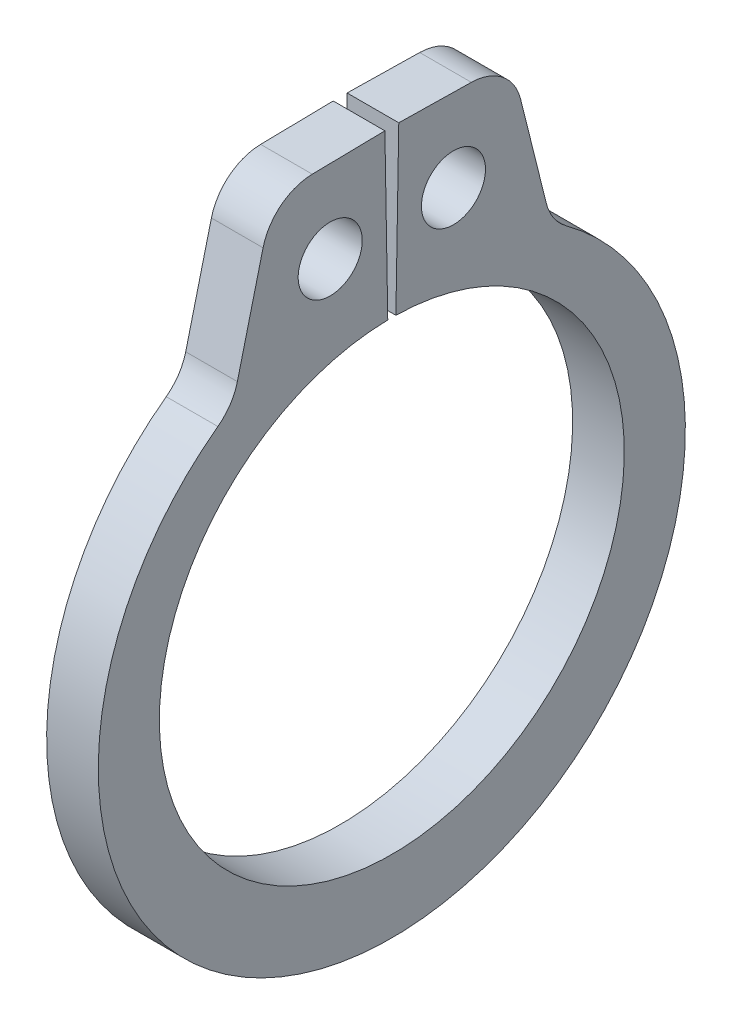
ISO-10303-21;
HEADER;
FILE_DESCRIPTION(('STEP AP214'),'2;1');
FILE_NAME('part.step','',(''),(''),'','','');
FILE_SCHEMA(('AUTOMOTIVE_DESIGN { 1 0 10303 214 1 1 1 1 }'));
ENDSEC;
DATA;
#1=APPLICATION_CONTEXT('core data for automotive mechanical design processes');
#2=APPLICATION_PROTOCOL_DEFINITION('international standard','automotive_design',2000,#1);
#3=PRODUCT_CONTEXT('',#1,'mechanical');
#4=PRODUCT('Part','Part','',(#3));
#5=PRODUCT_RELATED_PRODUCT_CATEGORY('part','',(#4));
#6=PRODUCT_DEFINITION_FORMATION('','',#4);
#7=PRODUCT_DEFINITION_CONTEXT('part definition',#1,'design');
#8=PRODUCT_DEFINITION('design','',#6,#7);
#9=PRODUCT_DEFINITION_SHAPE('','',#8);
#10=(LENGTH_UNIT() NAMED_UNIT(*) SI_UNIT(.MILLI.,.METRE.));
#11=(NAMED_UNIT(*) PLANE_ANGLE_UNIT() SI_UNIT($,.RADIAN.));
#12=(NAMED_UNIT(*) SI_UNIT($,.STERADIAN.) SOLID_ANGLE_UNIT());
#13=UNCERTAINTY_MEASURE_WITH_UNIT(LENGTH_MEASURE(1.E-05),#10,'distance_accuracy_value','');
#14=(GEOMETRIC_REPRESENTATION_CONTEXT(3) GLOBAL_UNCERTAINTY_ASSIGNED_CONTEXT((#13)) GLOBAL_UNIT_ASSIGNED_CONTEXT((#10,
#11,#12)) REPRESENTATION_CONTEXT('',''));
#15=CARTESIAN_POINT('',(0.,0.,0.));
#16=DIRECTION('',(0.,0.,1.));
#17=DIRECTION('',(1.,0.,0.));
#18=AXIS2_PLACEMENT_3D('',#15,#16,#17);
#19=CARTESIAN_POINT('',(0.3175,0.,0.));
#20=DIRECTION('',(1.,0.,0.));
#21=DIRECTION('',(0.,0.,-1.));
#22=AXIS2_PLACEMENT_3D('',#19,#20,#21);
#23=PLANE('',#22);
#24=CARTESIAN_POINT('',(0.3175,3.860869662097,0.757395096234009));
#25=DIRECTION('',(1.,0.,0.));
#26=DIRECTION('',(0.,0.,-1.));
#27=AXIS2_PLACEMENT_3D('',#24,#25,#26);
#28=CIRCLE('',#27,0.3937);
#29=CARTESIAN_POINT('',(0.3175,3.860869662097,0.363695096234009));
#30=VERTEX_POINT('',#29);
#31=EDGE_CURVE('E218',#30,#30,#28,.T.);
#32=ORIENTED_EDGE('',*,*,#31,.F.);
#33=EDGE_LOOP('',(#32));
#34=FACE_BOUND('',#33,.T.);
#35=DIRECTION('',(0.,0.970295726276,0.241921895599656));
#36=VECTOR('',#35,1.);
#37=CARTESIAN_POINT('',(0.3175,4.86467453528462,-1.46491994107348));
#38=LINE('',#37,#36);
#39=CARTESIAN_POINT('',(0.3175,3.12546492000381,-1.89855360097708));
#40=VERTEX_POINT('',#39);
#41=CARTESIAN_POINT('',(0.3175,4.39189538363105,-1.58279702274115));
#42=VERTEX_POINT('',#41);
#43=EDGE_CURVE('E201',#40,#42,#38,.T.);
#44=ORIENTED_EDGE('',*,*,#43,.T.);
#45=CARTESIAN_POINT('',(0.3175,4.23827497992527,-0.966659236555894));
#46=DIRECTION('',(1.,0.,0.));
#47=DIRECTION('',(0.,0.,-1.));
#48=AXIS2_PLACEMENT_3D('',#45,#46,#47);
#49=CIRCLE('',#48,0.635);
#50=CARTESIAN_POINT('',(0.3175,4.87317826634958,-0.977741514643561));
#51=VERTEX_POINT('',#50);
#52=EDGE_CURVE('E169',#42,#51,#49,.T.);
#53=ORIENTED_EDGE('',*,*,#52,.T.);
#54=DIRECTION('',(0.,0.0174524064372706,0.999847695156391));
#55=VECTOR('',#54,1.);
#56=CARTESIAN_POINT('',(0.3175,4.88875530546717,-0.0853335412750979));
#57=LINE('',#56,#55);
#58=CARTESIAN_POINT('',(0.3175,4.88875530546717,-0.0853335412750979));
#59=VERTEX_POINT('',#58);
#60=EDGE_CURVE('E207',#51,#59,#57,.T.);
#61=ORIENTED_EDGE('',*,*,#60,.T.);
#62=DIRECTION('',(0.,-0.999847695156391,0.0174524064372836));
#63=VECTOR('',#62,1.);
#64=CARTESIAN_POINT('',(0.3175,4.88875530546717,-0.0853335412750979));
#65=LINE('',#64,#63);
#66=CARTESIAN_POINT('',(0.3175,2.85706478890939,-0.0498702513945377));
#67=VERTEX_POINT('',#66);
#68=EDGE_CURVE('E141',#59,#67,#65,.T.);
#69=ORIENTED_EDGE('',*,*,#68,.T.);
#70=CARTESIAN_POINT('',(0.3175,0.,0.));
#71=DIRECTION('',(-1.,0.,0.));
#72=DIRECTION('',(0.,0.,-1.));
#73=AXIS2_PLACEMENT_3D('',#70,#71,#72);
#74=CIRCLE('',#73,2.8575);
#75=CARTESIAN_POINT('',(0.3175,2.85706478890939,0.0498702513945377));
#76=VERTEX_POINT('',#75);
#77=EDGE_CURVE('E135',#67,#76,#74,.T.);
#78=ORIENTED_EDGE('',*,*,#77,.T.);
#79=DIRECTION('',(0.,0.999847695156391,0.0174524064372836));
#80=VECTOR('',#79,1.);
#81=CARTESIAN_POINT('',(0.3175,2.85706478890939,0.0498702513945377));
#82=LINE('',#81,#80);
#83=CARTESIAN_POINT('',(0.3175,4.88875530546717,0.0853335412750979));
#84=VERTEX_POINT('',#83);
#85=EDGE_CURVE('E124',#76,#84,#82,.T.);
#86=ORIENTED_EDGE('',*,*,#85,.T.);
#87=DIRECTION('',(0.,-0.0174524064372832,0.999847695156391));
#88=VECTOR('',#87,1.);
#89=CARTESIAN_POINT('',(0.3175,4.88875530546717,0.0853335412750979));
#90=LINE('',#89,#88);
#91=CARTESIAN_POINT('',(0.3175,4.87317826634957,0.977741514643572));
#92=VERTEX_POINT('',#91);
#93=EDGE_CURVE('E134',#84,#92,#90,.T.);
#94=ORIENTED_EDGE('',*,*,#93,.T.);
#95=CARTESIAN_POINT('',(0.3175,4.23827497992526,0.966659236555897));
#96=DIRECTION('',(1.,0.,0.));
#97=DIRECTION('',(0.,0.,-1.));
#98=AXIS2_PLACEMENT_3D('',#95,#96,#97);
#99=CIRCLE('',#98,0.635);
#100=CARTESIAN_POINT('',(0.3175,4.39189538363105,1.58279702274116));
#101=VERTEX_POINT('',#100);
#102=EDGE_CURVE('E167',#92,#101,#99,.T.);
#103=ORIENTED_EDGE('',*,*,#102,.T.);
#104=DIRECTION('',(0.,-0.970295726275997,0.241921895599665));
#105=VECTOR('',#104,1.);
#106=CARTESIAN_POINT('',(0.3175,4.86467453528461,1.46491994107348));
#107=LINE('',#106,#105);
#108=CARTESIAN_POINT('',(0.3175,3.12546492000379,1.8985536009771));
#109=VERTEX_POINT('',#108);
#110=EDGE_CURVE('E210',#101,#109,#107,.T.);
#111=ORIENTED_EDGE('',*,*,#110,.T.);
#112=CARTESIAN_POINT('',(0.3175,3.27908532370958,2.51469138716236));
#113=DIRECTION('',(1.,0.,0.));
#114=DIRECTION('',(0.,0.,-1.));
#115=AXIS2_PLACEMENT_3D('',#112,#113,#114);
#116=CIRCLE('',#115,0.635);
#117=CARTESIAN_POINT('',(0.3175,2.76762449947218,2.13835001915932));
#118=VERTEX_POINT('',#117);
#119=EDGE_CURVE('E56',#109,#118,#116,.F.);
#120=ORIENTED_EDGE('',*,*,#119,.T.);
#121=CARTESIAN_POINT('',(0.3175,-0.138466502722576,0.));
#122=DIRECTION('',(1.,0.,0.));
#123=DIRECTION('',(0.,0.,-1.));
#124=AXIS2_PLACEMENT_3D('',#121,#122,#123);
#125=CIRCLE('',#124,3.60803349727742);
#126=CARTESIAN_POINT('',(0.3175,2.76762449947218,-2.13835001915931));
#127=VERTEX_POINT('',#126);
#128=EDGE_CURVE('E203',#118,#127,#125,.T.);
#129=ORIENTED_EDGE('',*,*,#128,.T.);
#130=CARTESIAN_POINT('',(0.3175,3.27908532370959,-2.51469138716234));
#131=DIRECTION('',(1.,0.,0.));
#132=DIRECTION('',(0.,0.,-1.));
#133=AXIS2_PLACEMENT_3D('',#130,#131,#132);
#134=CIRCLE('',#133,0.635);
#135=EDGE_CURVE('E11',#127,#40,#134,.F.);
#136=ORIENTED_EDGE('',*,*,#135,.T.);
#137=EDGE_LOOP('',(#44,#53,#61,#69,#78,#86,#94,#103,#111,#120,#129,#136));
#138=FACE_BOUND('',#137,.T.);
#139=CARTESIAN_POINT('',(0.3175,3.860869662097,-0.757395096234009));
#140=DIRECTION('',(1.,0.,0.));
#141=DIRECTION('',(0.,0.,-1.));
#142=AXIS2_PLACEMENT_3D('',#139,#140,#141);
#143=CIRCLE('',#142,0.3937);
#144=CARTESIAN_POINT('',(0.3175,3.860869662097,-1.15109509623401));
#145=VERTEX_POINT('',#144);
#146=EDGE_CURVE('E246',#145,#145,#143,.T.);
#147=ORIENTED_EDGE('',*,*,#146,.F.);
#148=EDGE_LOOP('',(#147));
#149=FACE_BOUND('',#148,.T.);
#150=ADVANCED_FACE('F34',(#34,#138,#149),#23,.T.);
#151=CARTESIAN_POINT('',(-0.3175,0.,0.));
#152=DIRECTION('',(1.,0.,0.));
#153=DIRECTION('',(0.,0.,-1.));
#154=AXIS2_PLACEMENT_3D('',#151,#152,#153);
#155=PLANE('',#154);
#156=CARTESIAN_POINT('',(-0.3175,3.860869662097,0.757395096234009));
#157=DIRECTION('',(1.,0.,0.));
#158=DIRECTION('',(0.,0.,-1.));
#159=AXIS2_PLACEMENT_3D('',#156,#157,#158);
#160=CIRCLE('',#159,0.3937);
#161=CARTESIAN_POINT('',(-0.3175,3.860869662097,0.363695096234009));
#162=VERTEX_POINT('',#161);
#163=EDGE_CURVE('E243',#162,#162,#160,.T.);
#164=ORIENTED_EDGE('',*,*,#163,.T.);
#165=EDGE_LOOP('',(#164));
#166=FACE_BOUND('',#165,.T.);
#167=DIRECTION('',(0.,0.0174524064372706,0.999847695156391));
#168=VECTOR('',#167,1.);
#169=CARTESIAN_POINT('',(-0.3175,4.88875530546717,-0.0853335412750979));
#170=LINE('',#169,#168);
#171=CARTESIAN_POINT('',(-0.3175,4.87317826634958,-0.977741514643561));
#172=VERTEX_POINT('',#171);
#173=CARTESIAN_POINT('',(-0.3175,4.88875530546717,-0.0853335412750979));
#174=VERTEX_POINT('',#173);
#175=EDGE_CURVE('E226',#172,#174,#170,.T.);
#176=ORIENTED_EDGE('',*,*,#175,.F.);
#177=CARTESIAN_POINT('',(-0.3175,4.23827497992527,-0.966659236555894));
#178=DIRECTION('',(1.,0.,0.));
#179=DIRECTION('',(0.,0.,-1.));
#180=AXIS2_PLACEMENT_3D('',#177,#178,#179);
#181=CIRCLE('',#180,0.635);
#182=CARTESIAN_POINT('',(-0.3175,4.39189538363105,-1.58279702274115));
#183=VERTEX_POINT('',#182);
#184=EDGE_CURVE('E160',#172,#183,#181,.F.);
#185=ORIENTED_EDGE('',*,*,#184,.T.);
#186=DIRECTION('',(0.,0.970295726276,0.241921895599656));
#187=VECTOR('',#186,1.);
#188=CARTESIAN_POINT('',(-0.3175,4.86467453528462,-1.46491994107348));
#189=LINE('',#188,#187);
#190=CARTESIAN_POINT('',(-0.3175,3.12546492000381,-1.89855360097708));
#191=VERTEX_POINT('',#190);
#192=EDGE_CURVE('E192',#191,#183,#189,.T.);
#193=ORIENTED_EDGE('',*,*,#192,.F.);
#194=CARTESIAN_POINT('',(-0.3175,3.27908532370959,-2.51469138716234));
#195=DIRECTION('',(1.,0.,0.));
#196=DIRECTION('',(0.,0.,-1.));
#197=AXIS2_PLACEMENT_3D('',#194,#195,#196);
#198=CIRCLE('',#197,0.635);
#199=CARTESIAN_POINT('',(-0.3175,2.76762449947218,-2.13835001915931));
#200=VERTEX_POINT('',#199);
#201=EDGE_CURVE('E42',#191,#200,#198,.T.);
#202=ORIENTED_EDGE('',*,*,#201,.T.);
#203=CARTESIAN_POINT('',(-0.3175,-0.138466502722576,0.));
#204=DIRECTION('',(1.,0.,0.));
#205=DIRECTION('',(0.,0.,-1.));
#206=AXIS2_PLACEMENT_3D('',#203,#204,#205);
#207=CIRCLE('',#206,3.60803349727742);
#208=CARTESIAN_POINT('',(-0.3175,2.76762449947218,2.13835001915932));
#209=VERTEX_POINT('',#208);
#210=EDGE_CURVE('E190',#209,#200,#207,.T.);
#211=ORIENTED_EDGE('',*,*,#210,.F.);
#212=CARTESIAN_POINT('',(-0.3175,3.27908532370958,2.51469138716236));
#213=DIRECTION('',(1.,0.,0.));
#214=DIRECTION('',(0.,0.,-1.));
#215=AXIS2_PLACEMENT_3D('',#212,#213,#214);
#216=CIRCLE('',#215,0.635);
#217=CARTESIAN_POINT('',(-0.3175,3.12546492000379,1.8985536009771));
#218=VERTEX_POINT('',#217);
#219=EDGE_CURVE('E182',#209,#218,#216,.T.);
#220=ORIENTED_EDGE('',*,*,#219,.T.);
#221=DIRECTION('',(0.,-0.970295726275997,0.241921895599665));
#222=VECTOR('',#221,1.);
#223=CARTESIAN_POINT('',(-0.3175,4.86467453528461,1.46491994107348));
#224=LINE('',#223,#222);
#225=CARTESIAN_POINT('',(-0.3175,4.39189538363105,1.58279702274116));
#226=VERTEX_POINT('',#225);
#227=EDGE_CURVE('E197',#226,#218,#224,.T.);
#228=ORIENTED_EDGE('',*,*,#227,.F.);
#229=CARTESIAN_POINT('',(-0.3175,4.23827497992526,0.966659236555897));
#230=DIRECTION('',(1.,0.,0.));
#231=DIRECTION('',(0.,0.,-1.));
#232=AXIS2_PLACEMENT_3D('',#229,#230,#231);
#233=CIRCLE('',#232,0.635);
#234=CARTESIAN_POINT('',(-0.3175,4.87317826634957,0.977741514643572));
#235=VERTEX_POINT('',#234);
#236=EDGE_CURVE('E153',#226,#235,#233,.F.);
#237=ORIENTED_EDGE('',*,*,#236,.T.);
#238=DIRECTION('',(0.,-0.0174524064372832,0.999847695156391));
#239=VECTOR('',#238,1.);
#240=CARTESIAN_POINT('',(-0.3175,4.88875530546717,0.0853335412750979));
#241=LINE('',#240,#239);
#242=CARTESIAN_POINT('',(-0.3175,4.88875530546717,0.0853335412750979));
#243=VERTEX_POINT('',#242);
#244=EDGE_CURVE('E220',#243,#235,#241,.T.);
#245=ORIENTED_EDGE('',*,*,#244,.F.);
#246=DIRECTION('',(0.,0.999847695156391,0.0174524064372836));
#247=VECTOR('',#246,1.);
#248=CARTESIAN_POINT('',(-0.3175,2.85706478890939,0.0498702513945377));
#249=LINE('',#248,#247);
#250=CARTESIAN_POINT('',(-0.3175,2.85706478890939,0.0498702513945377));
#251=VERTEX_POINT('',#250);
#252=EDGE_CURVE('E217',#251,#243,#249,.T.);
#253=ORIENTED_EDGE('',*,*,#252,.F.);
#254=CARTESIAN_POINT('',(-0.3175,0.,0.));
#255=DIRECTION('',(-1.,0.,0.));
#256=DIRECTION('',(0.,0.,-1.));
#257=AXIS2_PLACEMENT_3D('',#254,#255,#256);
#258=CIRCLE('',#257,2.8575);
#259=CARTESIAN_POINT('',(-0.3175,2.85706478890939,-0.0498702513945377));
#260=VERTEX_POINT('',#259);
#261=EDGE_CURVE('E149',#260,#251,#258,.T.);
#262=ORIENTED_EDGE('',*,*,#261,.F.);
#263=DIRECTION('',(0.,-0.999847695156391,0.0174524064372836));
#264=VECTOR('',#263,1.);
#265=CARTESIAN_POINT('',(-0.3175,4.88875530546717,-0.0853335412750979));
#266=LINE('',#265,#264);
#267=EDGE_CURVE('E145',#174,#260,#266,.T.);
#268=ORIENTED_EDGE('',*,*,#267,.F.);
#269=EDGE_LOOP('',(#176,#185,#193,#202,#211,#220,#228,#237,#245,#253,#262,#268));
#270=FACE_BOUND('',#269,.T.);
#271=CARTESIAN_POINT('',(-0.3175,3.860869662097,-0.757395096234009));
#272=DIRECTION('',(1.,0.,0.));
#273=DIRECTION('',(0.,0.,-1.));
#274=AXIS2_PLACEMENT_3D('',#271,#272,#273);
#275=CIRCLE('',#274,0.3937);
#276=CARTESIAN_POINT('',(-0.3175,3.860869662097,-1.15109509623401));
#277=VERTEX_POINT('',#276);
#278=EDGE_CURVE('E249',#277,#277,#275,.T.);
#279=ORIENTED_EDGE('',*,*,#278,.T.);
#280=EDGE_LOOP('',(#279));
#281=FACE_BOUND('',#280,.T.);
#282=ADVANCED_FACE('F188',(#166,#270,#281),#155,.F.);
#283=CARTESIAN_POINT('',(0.3175,0.,0.));
#284=DIRECTION('',(-1.,0.,0.));
#285=DIRECTION('',(0.,0.,1.));
#286=AXIS2_PLACEMENT_3D('',#283,#284,#285);
#287=CYLINDRICAL_SURFACE('',#286,2.8575);
#288=ORIENTED_EDGE('',*,*,#261,.T.);
#289=DIRECTION('',(-1.,0.,0.));
#290=VECTOR('',#289,1.);
#291=CARTESIAN_POINT('',(0.3175,2.85706478890939,0.0498702513945377));
#292=LINE('',#291,#290);
#293=EDGE_CURVE('E128',#76,#251,#292,.T.);
#294=ORIENTED_EDGE('',*,*,#293,.F.);
#295=ORIENTED_EDGE('',*,*,#77,.F.);
#296=DIRECTION('',(-1.,0.,0.));
#297=VECTOR('',#296,1.);
#298=CARTESIAN_POINT('',(0.3175,2.85706478890939,-0.0498702513945377));
#299=LINE('',#298,#297);
#300=EDGE_CURVE('E215',#67,#260,#299,.T.);
#301=ORIENTED_EDGE('',*,*,#300,.T.);
#302=EDGE_LOOP('',(#288,#294,#295,#301));
#303=FACE_BOUND('',#302,.T.);
#304=ADVANCED_FACE('F147',(#303),#287,.F.);
#305=CARTESIAN_POINT('',(0.3175,2.85706478890939,0.0498702513945377));
#306=DIRECTION('',(0.,-0.0174524064372836,0.999847695156391));
#307=DIRECTION('',(0.,-0.999847695156391,-0.0174524064372836));
#308=AXIS2_PLACEMENT_3D('',#305,#306,#307);
#309=PLANE('',#308);
#310=ORIENTED_EDGE('',*,*,#252,.T.);
#311=DIRECTION('',(-1.,0.,0.));
#312=VECTOR('',#311,1.);
#313=CARTESIAN_POINT('',(0.3175,4.88875530546717,0.0853335412750979));
#314=LINE('',#313,#312);
#315=EDGE_CURVE('E131',#84,#243,#314,.T.);
#316=ORIENTED_EDGE('',*,*,#315,.F.);
#317=ORIENTED_EDGE('',*,*,#85,.F.);
#318=ORIENTED_EDGE('',*,*,#293,.T.);
#319=EDGE_LOOP('',(#310,#316,#317,#318));
#320=FACE_BOUND('',#319,.T.);
#321=ADVANCED_FACE('F126',(#320),#309,.F.);
#322=CARTESIAN_POINT('',(0.3175,4.88875530546717,0.0853335412750979));
#323=DIRECTION('',(0.,-0.999847695156391,-0.0174524064372832));
#324=DIRECTION('',(0.,0.0174524064372832,-0.999847695156391));
#325=AXIS2_PLACEMENT_3D('',#322,#323,#324);
#326=PLANE('',#325);
#327=ORIENTED_EDGE('',*,*,#244,.T.);
#328=DIRECTION('',(-1.,0.,0.));
#329=VECTOR('',#328,1.);
#330=CARTESIAN_POINT('',(0.3175,4.87317826634957,0.977741514643572));
#331=LINE('',#330,#329);
#332=EDGE_CURVE('E176',#235,#92,#331,.F.);
#333=ORIENTED_EDGE('',*,*,#332,.T.);
#334=ORIENTED_EDGE('',*,*,#93,.F.);
#335=ORIENTED_EDGE('',*,*,#315,.T.);
#336=EDGE_LOOP('',(#327,#333,#334,#335));
#337=FACE_BOUND('',#336,.T.);
#338=ADVANCED_FACE('F238',(#337),#326,.F.);
#339=CARTESIAN_POINT('',(0.3175,4.86467453528461,1.46491994107348));
#340=DIRECTION('',(0.,-0.241921895599665,-0.970295726275997));
#341=DIRECTION('',(0.,0.970295726275997,-0.241921895599665));
#342=AXIS2_PLACEMENT_3D('',#339,#340,#341);
#343=PLANE('',#342);
#344=ORIENTED_EDGE('',*,*,#110,.F.);
#345=DIRECTION('',(-1.,0.,0.));
#346=VECTOR('',#345,1.);
#347=CARTESIAN_POINT('',(0.3175,4.39189538363105,1.58279702274116));
#348=LINE('',#347,#346);
#349=EDGE_CURVE('E173',#101,#226,#348,.T.);
#350=ORIENTED_EDGE('',*,*,#349,.T.);
#351=ORIENTED_EDGE('',*,*,#227,.T.);
#352=DIRECTION('',(1.,0.,0.));
#353=VECTOR('',#352,1.);
#354=CARTESIAN_POINT('',(0.3175,3.12546492000379,1.8985536009771));
#355=LINE('',#354,#353);
#356=EDGE_CURVE('E171',#218,#109,#355,.T.);
#357=ORIENTED_EDGE('',*,*,#356,.T.);
#358=EDGE_LOOP('',(#344,#350,#351,#357));
#359=FACE_BOUND('',#358,.T.);
#360=ADVANCED_FACE('F279',(#359),#343,.F.);
#361=CARTESIAN_POINT('',(0.3175,-0.138466502722576,0.));
#362=DIRECTION('',(-1.,0.,0.));
#363=DIRECTION('',(0.,0.,1.));
#364=AXIS2_PLACEMENT_3D('',#361,#362,#363);
#365=CYLINDRICAL_SURFACE('',#364,3.60803349727742);
#366=ORIENTED_EDGE('',*,*,#128,.F.);
#367=DIRECTION('',(-1.,0.,0.));
#368=VECTOR('',#367,1.);
#369=CARTESIAN_POINT('',(0.3175,2.76762449947218,2.13835001915932));
#370=LINE('',#369,#368);
#371=EDGE_CURVE('E179',#118,#209,#370,.T.);
#372=ORIENTED_EDGE('',*,*,#371,.T.);
#373=ORIENTED_EDGE('',*,*,#210,.T.);
#374=DIRECTION('',(-1.,0.,0.));
#375=VECTOR('',#374,1.);
#376=CARTESIAN_POINT('',(0.3175,2.76762449947219,-2.13835001915931));
#377=LINE('',#376,#375);
#378=EDGE_CURVE('E49',#200,#127,#377,.F.);
#379=ORIENTED_EDGE('',*,*,#378,.T.);
#380=EDGE_LOOP('',(#366,#372,#373,#379));
#381=FACE_BOUND('',#380,.T.);
#382=ADVANCED_FACE('F195',(#381),#365,.T.);
#383=CARTESIAN_POINT('',(0.3175,4.86467453528462,-1.46491994107348));
#384=DIRECTION('',(0.,-0.241921895599656,0.970295726276));
#385=DIRECTION('',(0.,-0.970295726276,-0.241921895599656));
#386=AXIS2_PLACEMENT_3D('',#383,#384,#385);
#387=PLANE('',#386);
#388=ORIENTED_EDGE('',*,*,#192,.T.);
#389=DIRECTION('',(-1.,0.,0.));
#390=VECTOR('',#389,1.);
#391=CARTESIAN_POINT('',(0.3175,4.39189538363105,-1.58279702274115));
#392=LINE('',#391,#390);
#393=EDGE_CURVE('E165',#183,#42,#392,.F.);
#394=ORIENTED_EDGE('',*,*,#393,.T.);
#395=ORIENTED_EDGE('',*,*,#43,.F.);
#396=DIRECTION('',(1.,0.,0.));
#397=VECTOR('',#396,1.);
#398=CARTESIAN_POINT('',(-0.3175,3.12546492000381,-1.89855360097708));
#399=LINE('',#398,#397);
#400=EDGE_CURVE('E162',#40,#191,#399,.F.);
#401=ORIENTED_EDGE('',*,*,#400,.T.);
#402=EDGE_LOOP('',(#388,#394,#395,#401));
#403=FACE_BOUND('',#402,.T.);
#404=ADVANCED_FACE('F205',(#403),#387,.F.);
#405=CARTESIAN_POINT('',(0.3175,4.88875530546717,-0.0853335412750979));
#406=DIRECTION('',(0.,-0.999847695156391,0.0174524064372706));
#407=DIRECTION('',(0.,-0.0174524064372706,-0.999847695156391));
#408=AXIS2_PLACEMENT_3D('',#405,#406,#407);
#409=PLANE('',#408);
#410=ORIENTED_EDGE('',*,*,#60,.F.);
#411=DIRECTION('',(-1.,0.,0.));
#412=VECTOR('',#411,1.);
#413=CARTESIAN_POINT('',(0.3175,4.87317826634958,-0.977741514643561));
#414=LINE('',#413,#412);
#415=EDGE_CURVE('E150',#51,#172,#414,.T.);
#416=ORIENTED_EDGE('',*,*,#415,.T.);
#417=ORIENTED_EDGE('',*,*,#175,.T.);
#418=DIRECTION('',(-1.,0.,0.));
#419=VECTOR('',#418,1.);
#420=CARTESIAN_POINT('',(0.3175,4.88875530546717,-0.0853335412750979));
#421=LINE('',#420,#419);
#422=EDGE_CURVE('E155',#59,#174,#421,.T.);
#423=ORIENTED_EDGE('',*,*,#422,.F.);
#424=EDGE_LOOP('',(#410,#416,#417,#423));
#425=FACE_BOUND('',#424,.T.);
#426=ADVANCED_FACE('F272',(#425),#409,.F.);
#427=CARTESIAN_POINT('',(0.3175,4.88875530546717,-0.0853335412750979));
#428=DIRECTION('',(0.,-0.0174524064372836,-0.999847695156391));
#429=DIRECTION('',(0.,0.999847695156391,-0.0174524064372836));
#430=AXIS2_PLACEMENT_3D('',#427,#428,#429);
#431=PLANE('',#430);
#432=ORIENTED_EDGE('',*,*,#267,.T.);
#433=ORIENTED_EDGE('',*,*,#300,.F.);
#434=ORIENTED_EDGE('',*,*,#68,.F.);
#435=ORIENTED_EDGE('',*,*,#422,.T.);
#436=EDGE_LOOP('',(#432,#433,#434,#435));
#437=FACE_BOUND('',#436,.T.);
#438=ADVANCED_FACE('F233',(#437),#431,.F.);
#439=CARTESIAN_POINT('',(0.3175,3.860869662097,0.757395096234009));
#440=DIRECTION('',(-1.,0.,0.));
#441=DIRECTION('',(0.,0.,1.));
#442=AXIS2_PLACEMENT_3D('',#439,#440,#441);
#443=CYLINDRICAL_SURFACE('',#442,0.3937);
#444=ORIENTED_EDGE('',*,*,#31,.T.);
#445=EDGE_LOOP('',(#444));
#446=FACE_BOUND('',#445,.T.);
#447=ORIENTED_EDGE('',*,*,#163,.F.);
#448=EDGE_LOOP('',(#447));
#449=FACE_BOUND('',#448,.T.);
#450=ADVANCED_FACE('F267',(#446,#449),#443,.F.);
#451=CARTESIAN_POINT('',(0.3175,3.860869662097,-0.757395096234009));
#452=DIRECTION('',(-1.,0.,0.));
#453=DIRECTION('',(0.,0.,1.));
#454=AXIS2_PLACEMENT_3D('',#451,#452,#453);
#455=CYLINDRICAL_SURFACE('',#454,0.3937);
#456=ORIENTED_EDGE('',*,*,#146,.T.);
#457=EDGE_LOOP('',(#456));
#458=FACE_BOUND('',#457,.T.);
#459=ORIENTED_EDGE('',*,*,#278,.F.);
#460=EDGE_LOOP('',(#459));
#461=FACE_BOUND('',#460,.T.);
#462=ADVANCED_FACE('F255',(#458,#461),#455,.F.);
#463=CARTESIAN_POINT('',(0.3175,4.23827497992527,-0.966659236555894));
#464=DIRECTION('',(-1.,0.,0.));
#465=DIRECTION('',(0.,0.,1.));
#466=AXIS2_PLACEMENT_3D('',#463,#464,#465);
#467=CYLINDRICAL_SURFACE('',#466,0.635);
#468=ORIENTED_EDGE('',*,*,#52,.F.);
#469=ORIENTED_EDGE('',*,*,#393,.F.);
#470=ORIENTED_EDGE('',*,*,#184,.F.);
#471=ORIENTED_EDGE('',*,*,#415,.F.);
#472=EDGE_LOOP('',(#468,#469,#470,#471));
#473=FACE_BOUND('',#472,.T.);
#474=ADVANCED_FACE('F289',(#473),#467,.T.);
#475=CARTESIAN_POINT('',(0.3175,4.23827497992526,0.966659236555897));
#476=DIRECTION('',(-1.,0.,0.));
#477=DIRECTION('',(0.,0.,1.));
#478=AXIS2_PLACEMENT_3D('',#475,#476,#477);
#479=CYLINDRICAL_SURFACE('',#478,0.635);
#480=ORIENTED_EDGE('',*,*,#102,.F.);
#481=ORIENTED_EDGE('',*,*,#332,.F.);
#482=ORIENTED_EDGE('',*,*,#236,.F.);
#483=ORIENTED_EDGE('',*,*,#349,.F.);
#484=EDGE_LOOP('',(#480,#481,#482,#483));
#485=FACE_BOUND('',#484,.T.);
#486=ADVANCED_FACE('F292',(#485),#479,.T.);
#487=CARTESIAN_POINT('',(0.3175,3.27908532370958,2.51469138716236));
#488=DIRECTION('',(-1.,0.,0.));
#489=DIRECTION('',(0.,0.,1.));
#490=AXIS2_PLACEMENT_3D('',#487,#488,#489);
#491=CYLINDRICAL_SURFACE('',#490,0.635);
#492=ORIENTED_EDGE('',*,*,#119,.F.);
#493=ORIENTED_EDGE('',*,*,#356,.F.);
#494=ORIENTED_EDGE('',*,*,#219,.F.);
#495=ORIENTED_EDGE('',*,*,#371,.F.);
#496=EDGE_LOOP('',(#492,#493,#494,#495));
#497=FACE_BOUND('',#496,.T.);
#498=ADVANCED_FACE('F295',(#497),#491,.F.);
#499=CARTESIAN_POINT('',(0.3175,3.27908532370959,-2.51469138716234));
#500=DIRECTION('',(-1.,0.,0.));
#501=DIRECTION('',(0.,0.,1.));
#502=AXIS2_PLACEMENT_3D('',#499,#500,#501);
#503=CYLINDRICAL_SURFACE('',#502,0.635);
#504=ORIENTED_EDGE('',*,*,#135,.F.);
#505=ORIENTED_EDGE('',*,*,#378,.F.);
#506=ORIENTED_EDGE('',*,*,#201,.F.);
#507=ORIENTED_EDGE('',*,*,#400,.F.);
#508=EDGE_LOOP('',(#504,#505,#506,#507));
#509=FACE_BOUND('',#508,.T.);
#510=ADVANCED_FACE('F36',(#509),#503,.F.);
#511=CLOSED_SHELL('',(#150,#282,#304,#321,#338,#360,#382,#404,#426,#438,#450,#462,#474,#486,
#498,#510));
#512=MANIFOLD_SOLID_BREP('B2',#511);
#513=ADVANCED_BREP_SHAPE_REPRESENTATION('',(#18,#512),#14);
#514=SHAPE_DEFINITION_REPRESENTATION(#9,#513);
ENDSEC;
END-ISO-10303-21;
